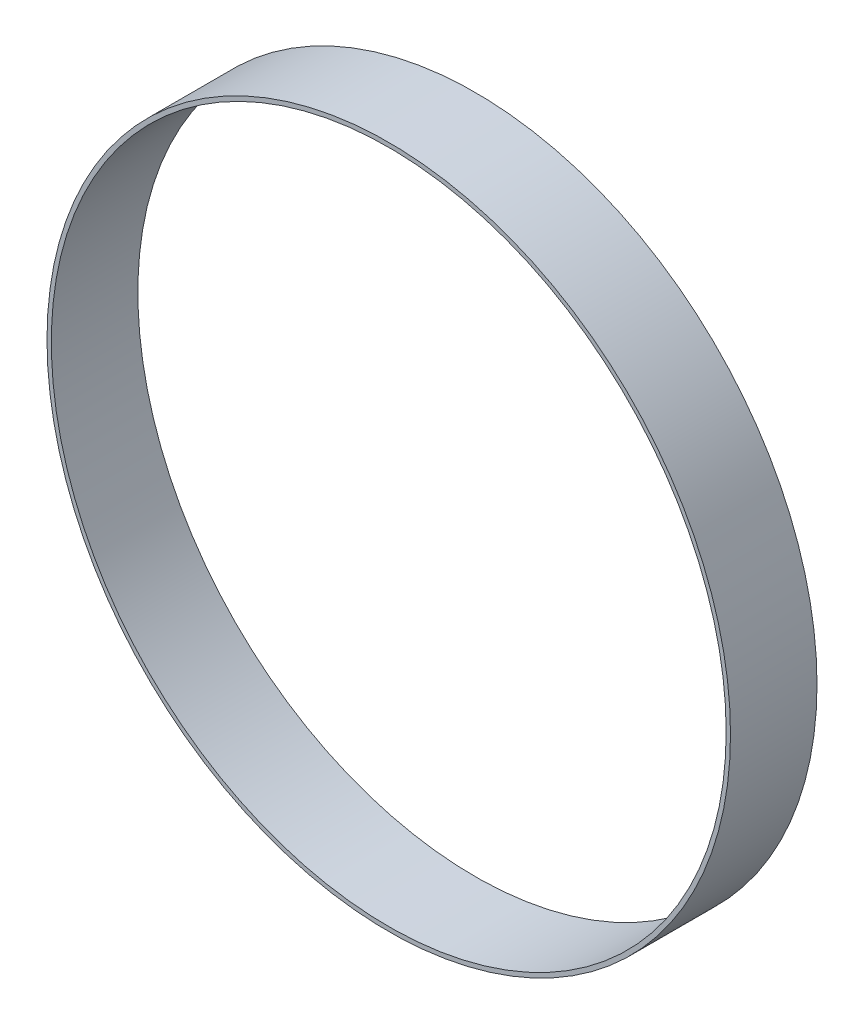
ISO-10303-21;
HEADER;
FILE_DESCRIPTION(('STEP AP214'),'2;1');
FILE_NAME('part.step','',(''),(''),'','','');
FILE_SCHEMA(('AUTOMOTIVE_DESIGN { 1 0 10303 214 1 1 1 1 }'));
ENDSEC;
DATA;
#1=APPLICATION_CONTEXT('core data for automotive mechanical design processes');
#2=APPLICATION_PROTOCOL_DEFINITION('international standard','automotive_design',2000,#1);
#3=PRODUCT_CONTEXT('',#1,'mechanical');
#4=PRODUCT('Part','Part','',(#3));
#5=PRODUCT_RELATED_PRODUCT_CATEGORY('part','',(#4));
#6=PRODUCT_DEFINITION_FORMATION('','',#4);
#7=PRODUCT_DEFINITION_CONTEXT('part definition',#1,'design');
#8=PRODUCT_DEFINITION('design','',#6,#7);
#9=PRODUCT_DEFINITION_SHAPE('','',#8);
#10=(LENGTH_UNIT() NAMED_UNIT(*) SI_UNIT(.MILLI.,.METRE.));
#11=(NAMED_UNIT(*) PLANE_ANGLE_UNIT() SI_UNIT($,.RADIAN.));
#12=(NAMED_UNIT(*) SI_UNIT($,.STERADIAN.) SOLID_ANGLE_UNIT());
#13=UNCERTAINTY_MEASURE_WITH_UNIT(LENGTH_MEASURE(1.E-05),#10,'distance_accuracy_value','');
#14=(GEOMETRIC_REPRESENTATION_CONTEXT(3) GLOBAL_UNCERTAINTY_ASSIGNED_CONTEXT((#13)) GLOBAL_UNIT_ASSIGNED_CONTEXT((#10,
#11,#12)) REPRESENTATION_CONTEXT('',''));
#15=CARTESIAN_POINT('',(0.,0.,0.));
#16=DIRECTION('',(0.,0.,1.));
#17=DIRECTION('',(1.,0.,0.));
#18=AXIS2_PLACEMENT_3D('',#15,#16,#17);
#19=CARTESIAN_POINT('',(0.,0.,5.));
#20=DIRECTION('',(0.,0.,1.));
#21=DIRECTION('',(1.,0.,0.));
#22=AXIS2_PLACEMENT_3D('',#19,#20,#21);
#23=PLANE('',#22);
#24=CARTESIAN_POINT('',(0.,0.,5.));
#25=DIRECTION('',(0.,0.,1.));
#26=DIRECTION('',(1.,0.,0.));
#27=AXIS2_PLACEMENT_3D('',#24,#25,#26);
#28=CIRCLE('',#27,39.5);
#29=CARTESIAN_POINT('',(39.5,0.,5.));
#30=VERTEX_POINT('',#29);
#31=EDGE_CURVE('E10',#30,#30,#28,.T.);
#32=ORIENTED_EDGE('',*,*,#31,.T.);
#33=EDGE_LOOP('',(#32));
#34=FACE_BOUND('',#33,.T.);
#35=CARTESIAN_POINT('',(0.,0.,5.));
#36=DIRECTION('',(0.,0.,1.));
#37=DIRECTION('',(1.,0.,0.));
#38=AXIS2_PLACEMENT_3D('',#35,#36,#37);
#39=CIRCLE('',#38,39.);
#40=CARTESIAN_POINT('',(39.,0.,5.));
#41=VERTEX_POINT('',#40);
#42=EDGE_CURVE('E60',#41,#41,#39,.T.);
#43=ORIENTED_EDGE('',*,*,#42,.F.);
#44=EDGE_LOOP('',(#43));
#45=FACE_BOUND('',#44,.T.);
#46=ADVANCED_FACE('F47',(#34,#45),#23,.T.);
#47=CARTESIAN_POINT('',(0.,0.,-5.));
#48=DIRECTION('',(0.,0.,1.));
#49=DIRECTION('',(1.,0.,0.));
#50=AXIS2_PLACEMENT_3D('',#47,#48,#49);
#51=PLANE('',#50);
#52=CARTESIAN_POINT('',(0.,0.,-5.));
#53=DIRECTION('',(0.,0.,1.));
#54=DIRECTION('',(1.,0.,0.));
#55=AXIS2_PLACEMENT_3D('',#52,#53,#54);
#56=CIRCLE('',#55,39.5);
#57=CARTESIAN_POINT('',(39.5,0.,-5.));
#58=VERTEX_POINT('',#57);
#59=EDGE_CURVE('E51',#58,#58,#56,.T.);
#60=ORIENTED_EDGE('',*,*,#59,.F.);
#61=EDGE_LOOP('',(#60));
#62=FACE_BOUND('',#61,.T.);
#63=CARTESIAN_POINT('',(0.,0.,-5.));
#64=DIRECTION('',(0.,0.,1.));
#65=DIRECTION('',(1.,0.,0.));
#66=AXIS2_PLACEMENT_3D('',#63,#64,#65);
#67=CIRCLE('',#66,39.);
#68=CARTESIAN_POINT('',(39.,0.,-5.));
#69=VERTEX_POINT('',#68);
#70=EDGE_CURVE('E62',#69,#69,#67,.T.);
#71=ORIENTED_EDGE('',*,*,#70,.T.);
#72=EDGE_LOOP('',(#71));
#73=FACE_BOUND('',#72,.T.);
#74=ADVANCED_FACE('F74',(#62,#73),#51,.F.);
#75=CARTESIAN_POINT('',(0.,0.,5.));
#76=DIRECTION('',(0.,0.,-1.));
#77=DIRECTION('',(-1.,0.,0.));
#78=AXIS2_PLACEMENT_3D('',#75,#76,#77);
#79=CYLINDRICAL_SURFACE('',#78,39.5);
#80=ORIENTED_EDGE('',*,*,#31,.F.);
#81=EDGE_LOOP('',(#80));
#82=FACE_BOUND('',#81,.T.);
#83=ORIENTED_EDGE('',*,*,#59,.T.);
#84=EDGE_LOOP('',(#83));
#85=FACE_BOUND('',#84,.T.);
#86=ADVANCED_FACE('F49',(#82,#85),#79,.T.);
#87=CARTESIAN_POINT('',(0.,0.,5.));
#88=DIRECTION('',(0.,0.,-1.));
#89=DIRECTION('',(-1.,0.,0.));
#90=AXIS2_PLACEMENT_3D('',#87,#88,#89);
#91=CYLINDRICAL_SURFACE('',#90,39.);
#92=ORIENTED_EDGE('',*,*,#42,.T.);
#93=EDGE_LOOP('',(#92));
#94=FACE_BOUND('',#93,.T.);
#95=ORIENTED_EDGE('',*,*,#70,.F.);
#96=EDGE_LOOP('',(#95));
#97=FACE_BOUND('',#96,.T.);
#98=ADVANCED_FACE('F70',(#94,#97),#91,.F.);
#99=CLOSED_SHELL('',(#46,#74,#86,#98));
#100=MANIFOLD_SOLID_BREP('B2',#99);
#101=ADVANCED_BREP_SHAPE_REPRESENTATION('',(#18,#100),#14);
#102=SHAPE_DEFINITION_REPRESENTATION(#9,#101);
ENDSEC;
END-ISO-10303-21;
